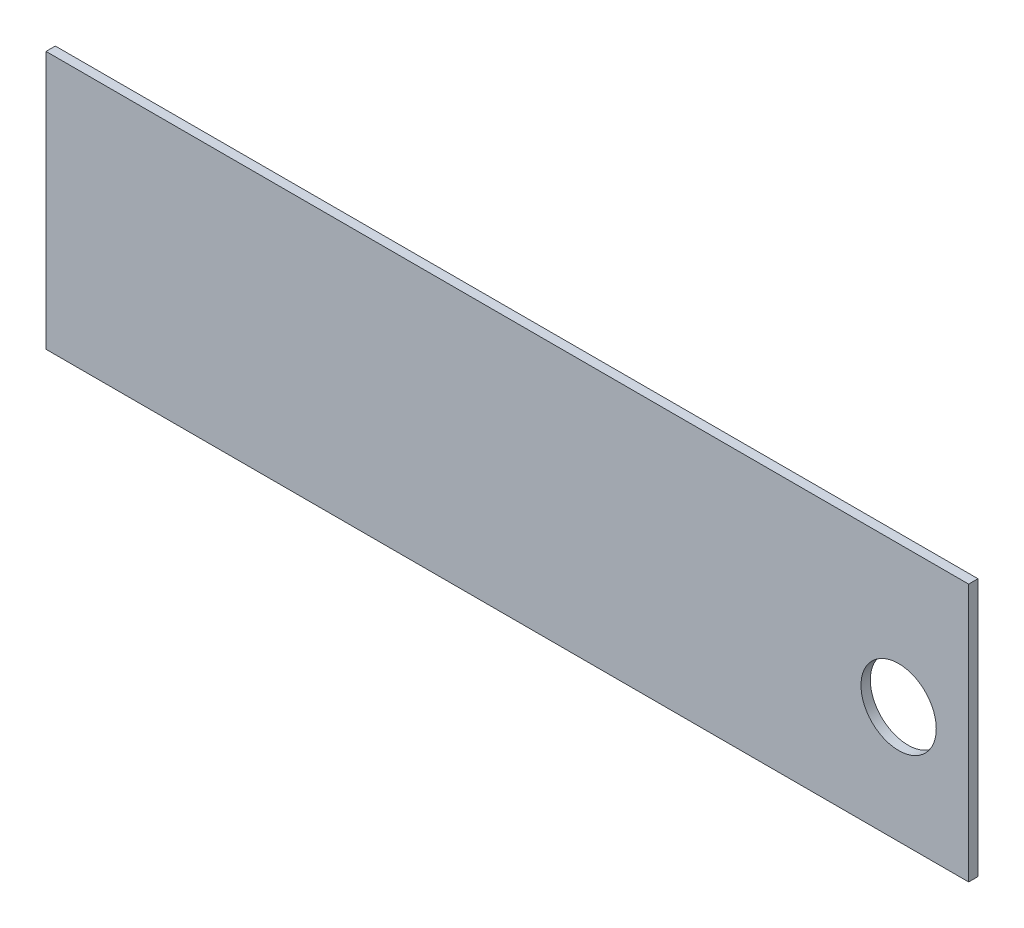
ISO-10303-21;
HEADER;
FILE_DESCRIPTION(('STEP AP214'),'2;1');
FILE_NAME('part.step','',(''),(''),'','','');
FILE_SCHEMA(('AUTOMOTIVE_DESIGN { 1 0 10303 214 1 1 1 1 }'));
ENDSEC;
DATA;
#1=APPLICATION_CONTEXT('core data for automotive mechanical design processes');
#2=APPLICATION_PROTOCOL_DEFINITION('international standard','automotive_design',2000,#1);
#3=PRODUCT_CONTEXT('',#1,'mechanical');
#4=PRODUCT('Part','Part','',(#3));
#5=PRODUCT_RELATED_PRODUCT_CATEGORY('part','',(#4));
#6=PRODUCT_DEFINITION_FORMATION('','',#4);
#7=PRODUCT_DEFINITION_CONTEXT('part definition',#1,'design');
#8=PRODUCT_DEFINITION('design','',#6,#7);
#9=PRODUCT_DEFINITION_SHAPE('','',#8);
#10=(LENGTH_UNIT() NAMED_UNIT(*) SI_UNIT(.MILLI.,.METRE.));
#11=(NAMED_UNIT(*) PLANE_ANGLE_UNIT() SI_UNIT($,.RADIAN.));
#12=(NAMED_UNIT(*) SI_UNIT($,.STERADIAN.) SOLID_ANGLE_UNIT());
#13=UNCERTAINTY_MEASURE_WITH_UNIT(LENGTH_MEASURE(1.E-05),#10,'distance_accuracy_value','');
#14=(GEOMETRIC_REPRESENTATION_CONTEXT(3) GLOBAL_UNCERTAINTY_ASSIGNED_CONTEXT((#13)) GLOBAL_UNIT_ASSIGNED_CONTEXT((#10,
#11,#12)) REPRESENTATION_CONTEXT('',''));
#15=CARTESIAN_POINT('',(0.,0.,0.));
#16=DIRECTION('',(0.,0.,1.));
#17=DIRECTION('',(1.,0.,0.));
#18=AXIS2_PLACEMENT_3D('',#15,#16,#17);
#19=CARTESIAN_POINT('',(-52.9649285951936,-15.9782466153098,3.16));
#20=DIRECTION('',(0.,1.,0.));
#21=DIRECTION('',(0.,0.,1.));
#22=AXIS2_PLACEMENT_3D('',#19,#20,#21);
#23=PLANE('',#22);
#24=DIRECTION('',(1.,0.,0.));
#25=VECTOR('',#24,1.);
#26=CARTESIAN_POINT('',(-52.9649285951936,-15.9782466153098,0.));
#27=LINE('',#26,#25);
#28=CARTESIAN_POINT('',(-112.964928595194,-15.9782466153098,0.));
#29=VERTEX_POINT('',#28);
#30=CARTESIAN_POINT('',(199.515071404806,-15.9782466153098,0.));
#31=VERTEX_POINT('',#30);
#32=EDGE_CURVE('E93',#29,#31,#27,.T.);
#33=ORIENTED_EDGE('',*,*,#32,.T.);
#34=DIRECTION('',(0.,0.,-1.));
#35=VECTOR('',#34,1.);
#36=CARTESIAN_POINT('',(199.515071404807,-15.9782466153098,3.16));
#37=LINE('',#36,#35);
#38=CARTESIAN_POINT('',(199.515071404807,-15.9782466153098,3.16));
#39=VERTEX_POINT('',#38);
#40=EDGE_CURVE('E51',#39,#31,#37,.T.);
#41=ORIENTED_EDGE('',*,*,#40,.F.);
#42=DIRECTION('',(1.,0.,0.));
#43=VECTOR('',#42,1.);
#44=CARTESIAN_POINT('',(-52.9649285951936,-15.9782466153098,3.16));
#45=LINE('',#44,#43);
#46=CARTESIAN_POINT('',(-112.964928595194,-15.9782466153098,3.16));
#47=VERTEX_POINT('',#46);
#48=EDGE_CURVE('E43',#47,#39,#45,.T.);
#49=ORIENTED_EDGE('',*,*,#48,.F.);
#50=DIRECTION('',(0.,0.,1.));
#51=VECTOR('',#50,1.);
#52=CARTESIAN_POINT('',(-112.964928595194,-15.9782466153098,3.16));
#53=LINE('',#52,#51);
#54=EDGE_CURVE('E95',#29,#47,#53,.T.);
#55=ORIENTED_EDGE('',*,*,#54,.F.);
#56=EDGE_LOOP('',(#33,#41,#49,#55));
#57=FACE_BOUND('',#56,.T.);
#58=ADVANCED_FACE('F35',(#57),#23,.F.);
#59=CARTESIAN_POINT('',(-52.9649285951936,71.3917533846902,3.16));
#60=DIRECTION('',(0.,-1.,0.));
#61=DIRECTION('',(0.,0.,-1.));
#62=AXIS2_PLACEMENT_3D('',#59,#60,#61);
#63=PLANE('',#62);
#64=DIRECTION('',(-1.,0.,0.));
#65=VECTOR('',#64,1.);
#66=CARTESIAN_POINT('',(-52.9649285951936,71.3917533846902,3.16));
#67=LINE('',#66,#65);
#68=CARTESIAN_POINT('',(199.515071404807,71.3917533846902,3.16));
#69=VERTEX_POINT('',#68);
#70=CARTESIAN_POINT('',(-112.964928595194,71.3917533846902,3.16));
#71=VERTEX_POINT('',#70);
#72=EDGE_CURVE('E11',#69,#71,#67,.T.);
#73=ORIENTED_EDGE('',*,*,#72,.F.);
#74=DIRECTION('',(0.,0.,-1.));
#75=VECTOR('',#74,1.);
#76=CARTESIAN_POINT('',(199.515071404807,71.3917533846902,3.16));
#77=LINE('',#76,#75);
#78=CARTESIAN_POINT('',(199.515071404807,71.3917533846902,0.));
#79=VERTEX_POINT('',#78);
#80=EDGE_CURVE('E76',#69,#79,#77,.T.);
#81=ORIENTED_EDGE('',*,*,#80,.T.);
#82=DIRECTION('',(-1.,0.,0.));
#83=VECTOR('',#82,1.);
#84=CARTESIAN_POINT('',(-52.9649285951936,71.3917533846902,0.));
#85=LINE('',#84,#83);
#86=CARTESIAN_POINT('',(-112.964928595194,71.3917533846902,0.));
#87=VERTEX_POINT('',#86);
#88=EDGE_CURVE('E86',#79,#87,#85,.T.);
#89=ORIENTED_EDGE('',*,*,#88,.T.);
#90=DIRECTION('',(0.,0.,-1.));
#91=VECTOR('',#90,1.);
#92=CARTESIAN_POINT('',(-112.964928595194,71.3917533846902,3.16));
#93=LINE('',#92,#91);
#94=EDGE_CURVE('E100',#71,#87,#93,.T.);
#95=ORIENTED_EDGE('',*,*,#94,.F.);
#96=EDGE_LOOP('',(#73,#81,#89,#95));
#97=FACE_BOUND('',#96,.T.);
#98=ADVANCED_FACE('F84',(#97),#63,.F.);
#99=CARTESIAN_POINT('',(0.,0.,3.16));
#100=DIRECTION('',(0.,0.,1.));
#101=DIRECTION('',(1.,0.,0.));
#102=AXIS2_PLACEMENT_3D('',#99,#100,#101);
#103=PLANE('',#102);
#104=CARTESIAN_POINT('',(175.793559829884,23.4752975595782,3.16));
#105=DIRECTION('',(0.,0.,1.));
#106=DIRECTION('',(1.,0.,0.));
#107=AXIS2_PLACEMENT_3D('',#104,#105,#106);
#108=CIRCLE('',#107,12.75);
#109=CARTESIAN_POINT('',(188.543559829884,23.4752975595782,3.16));
#110=VERTEX_POINT('',#109);
#111=EDGE_CURVE('E108',#110,#110,#108,.T.);
#112=ORIENTED_EDGE('',*,*,#111,.F.);
#113=EDGE_LOOP('',(#112));
#114=FACE_BOUND('',#113,.T.);
#115=DIRECTION('',(0.,-1.,0.));
#116=VECTOR('',#115,1.);
#117=CARTESIAN_POINT('',(199.515071404807,71.3917533846902,3.16));
#118=LINE('',#117,#116);
#119=EDGE_CURVE('E105',#69,#39,#118,.T.);
#120=ORIENTED_EDGE('',*,*,#119,.F.);
#121=ORIENTED_EDGE('',*,*,#72,.T.);
#122=DIRECTION('',(0.,1.,0.));
#123=VECTOR('',#122,1.);
#124=CARTESIAN_POINT('',(-112.964928595194,71.3917533846902,3.16));
#125=LINE('',#124,#123);
#126=EDGE_CURVE('E102',#47,#71,#125,.T.);
#127=ORIENTED_EDGE('',*,*,#126,.F.);
#128=ORIENTED_EDGE('',*,*,#48,.T.);
#129=EDGE_LOOP('',(#120,#121,#127,#128));
#130=FACE_BOUND('',#129,.T.);
#131=ADVANCED_FACE('F128',(#114,#130),#103,.T.);
#132=CARTESIAN_POINT('',(0.,0.,0.));
#133=DIRECTION('',(0.,0.,1.));
#134=DIRECTION('',(1.,0.,0.));
#135=AXIS2_PLACEMENT_3D('',#132,#133,#134);
#136=PLANE('',#135);
#137=CARTESIAN_POINT('',(175.793559829884,23.4752975595782,0.));
#138=DIRECTION('',(0.,0.,1.));
#139=DIRECTION('',(1.,0.,0.));
#140=AXIS2_PLACEMENT_3D('',#137,#138,#139);
#141=CIRCLE('',#140,12.75);
#142=CARTESIAN_POINT('',(188.543559829884,23.4752975595782,0.));
#143=VERTEX_POINT('',#142);
#144=EDGE_CURVE('E38',#143,#143,#141,.T.);
#145=ORIENTED_EDGE('',*,*,#144,.T.);
#146=EDGE_LOOP('',(#145));
#147=FACE_BOUND('',#146,.T.);
#148=ORIENTED_EDGE('',*,*,#88,.F.);
#149=DIRECTION('',(0.,-1.,0.));
#150=VECTOR('',#149,1.);
#151=CARTESIAN_POINT('',(199.515071404807,71.3917533846902,0.));
#152=LINE('',#151,#150);
#153=EDGE_CURVE('E73',#79,#31,#152,.T.);
#154=ORIENTED_EDGE('',*,*,#153,.T.);
#155=ORIENTED_EDGE('',*,*,#32,.F.);
#156=DIRECTION('',(0.,-1.,0.));
#157=VECTOR('',#156,1.);
#158=CARTESIAN_POINT('',(-112.964928595194,71.3917533846902,0.));
#159=LINE('',#158,#157);
#160=EDGE_CURVE('E92',#87,#29,#159,.T.);
#161=ORIENTED_EDGE('',*,*,#160,.F.);
#162=EDGE_LOOP('',(#148,#154,#155,#161));
#163=FACE_BOUND('',#162,.T.);
#164=ADVANCED_FACE('F90',(#147,#163),#136,.F.);
#165=CARTESIAN_POINT('',(-112.964928595194,0.,0.));
#166=DIRECTION('',(1.,0.,0.));
#167=DIRECTION('',(0.,1.,0.));
#168=AXIS2_PLACEMENT_3D('',#165,#166,#167);
#169=PLANE('',#168);
#170=ORIENTED_EDGE('',*,*,#126,.T.);
#171=ORIENTED_EDGE('',*,*,#94,.T.);
#172=ORIENTED_EDGE('',*,*,#160,.T.);
#173=ORIENTED_EDGE('',*,*,#54,.T.);
#174=EDGE_LOOP('',(#170,#171,#172,#173));
#175=FACE_BOUND('',#174,.T.);
#176=ADVANCED_FACE('F122',(#175),#169,.F.);
#177=CARTESIAN_POINT('',(199.515071404807,0.,0.));
#178=DIRECTION('',(-1.,0.,0.));
#179=DIRECTION('',(0.,0.,1.));
#180=AXIS2_PLACEMENT_3D('',#177,#178,#179);
#181=PLANE('',#180);
#182=ORIENTED_EDGE('',*,*,#80,.F.);
#183=ORIENTED_EDGE('',*,*,#119,.T.);
#184=ORIENTED_EDGE('',*,*,#40,.T.);
#185=ORIENTED_EDGE('',*,*,#153,.F.);
#186=EDGE_LOOP('',(#182,#183,#184,#185));
#187=FACE_BOUND('',#186,.T.);
#188=ADVANCED_FACE('F75',(#187),#181,.F.);
#189=CARTESIAN_POINT('',(175.793559829884,23.4752975595782,-6.84));
#190=DIRECTION('',(0.,0.,1.));
#191=DIRECTION('',(1.,0.,0.));
#192=AXIS2_PLACEMENT_3D('',#189,#190,#191);
#193=CYLINDRICAL_SURFACE('',#192,12.75);
#194=ORIENTED_EDGE('',*,*,#111,.T.);
#195=EDGE_LOOP('',(#194));
#196=FACE_BOUND('',#195,.T.);
#197=ORIENTED_EDGE('',*,*,#144,.F.);
#198=EDGE_LOOP('',(#197));
#199=FACE_BOUND('',#198,.T.);
#200=ADVANCED_FACE('F116',(#196,#199),#193,.F.);
#201=CLOSED_SHELL('',(#58,#98,#131,#164,#176,#188,#200));
#202=MANIFOLD_SOLID_BREP('B2',#201);
#203=ADVANCED_BREP_SHAPE_REPRESENTATION('',(#18,#202),#14);
#204=SHAPE_DEFINITION_REPRESENTATION(#9,#203);
ENDSEC;
END-ISO-10303-21;
